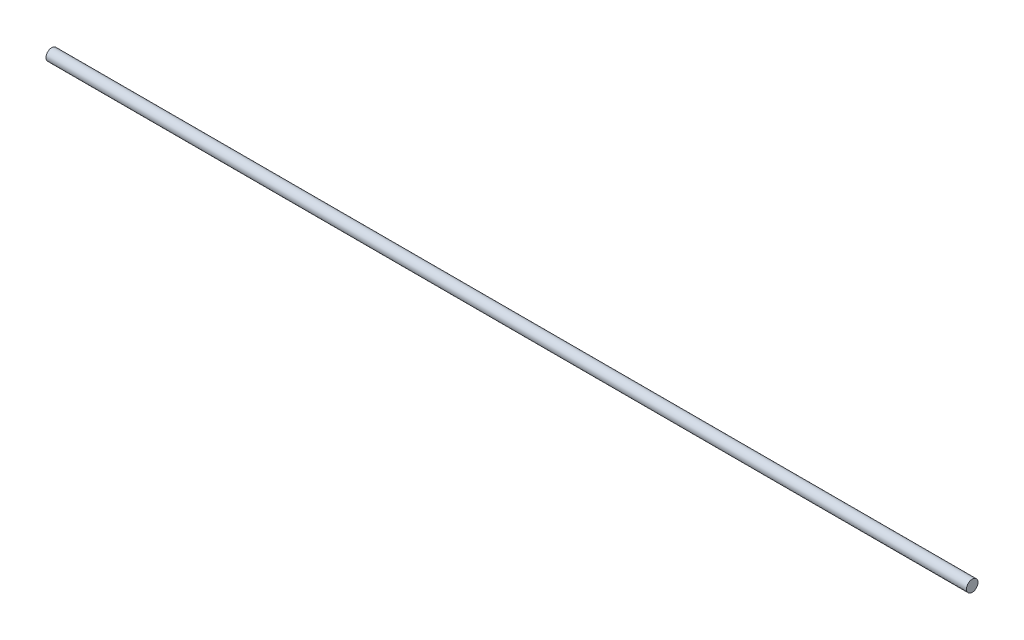
ISO-10303-21;
HEADER;
FILE_DESCRIPTION(('STEP AP214'),'2;1');
FILE_NAME('part.step','',(''),(''),'','','');
FILE_SCHEMA(('AUTOMOTIVE_DESIGN { 1 0 10303 214 1 1 1 1 }'));
ENDSEC;
DATA;
#1=APPLICATION_CONTEXT('core data for automotive mechanical design processes');
#2=APPLICATION_PROTOCOL_DEFINITION('international standard','automotive_design',2000,#1);
#3=PRODUCT_CONTEXT('',#1,'mechanical');
#4=PRODUCT('Part','Part','',(#3));
#5=PRODUCT_RELATED_PRODUCT_CATEGORY('part','',(#4));
#6=PRODUCT_DEFINITION_FORMATION('','',#4);
#7=PRODUCT_DEFINITION_CONTEXT('part definition',#1,'design');
#8=PRODUCT_DEFINITION('design','',#6,#7);
#9=PRODUCT_DEFINITION_SHAPE('','',#8);
#10=(LENGTH_UNIT() NAMED_UNIT(*) SI_UNIT(.MILLI.,.METRE.));
#11=(NAMED_UNIT(*) PLANE_ANGLE_UNIT() SI_UNIT($,.RADIAN.));
#12=(NAMED_UNIT(*) SI_UNIT($,.STERADIAN.) SOLID_ANGLE_UNIT());
#13=UNCERTAINTY_MEASURE_WITH_UNIT(LENGTH_MEASURE(1.E-05),#10,'distance_accuracy_value','');
#14=(GEOMETRIC_REPRESENTATION_CONTEXT(3) GLOBAL_UNCERTAINTY_ASSIGNED_CONTEXT((#13)) GLOBAL_UNIT_ASSIGNED_CONTEXT((#10,
#11,#12)) REPRESENTATION_CONTEXT('',''));
#15=CARTESIAN_POINT('',(0.,0.,0.));
#16=DIRECTION('',(0.,0.,1.));
#17=DIRECTION('',(1.,0.,0.));
#18=AXIS2_PLACEMENT_3D('',#15,#16,#17);
#19=CARTESIAN_POINT('',(400.,0.,0.));
#20=DIRECTION('',(-1.,0.,0.));
#21=DIRECTION('',(0.,0.,1.));
#22=AXIS2_PLACEMENT_3D('',#19,#20,#21);
#23=CYLINDRICAL_SURFACE('',#22,5.);
#24=CARTESIAN_POINT('',(400.,0.,0.));
#25=DIRECTION('',(1.,0.,0.));
#26=DIRECTION('',(0.,0.,-1.));
#27=AXIS2_PLACEMENT_3D('',#24,#25,#26);
#28=CIRCLE('',#27,5.);
#29=CARTESIAN_POINT('',(400.,0.,-5.));
#30=VERTEX_POINT('',#29);
#31=EDGE_CURVE('E10',#30,#30,#28,.T.);
#32=ORIENTED_EDGE('',*,*,#31,.F.);
#33=EDGE_LOOP('',(#32));
#34=FACE_BOUND('',#33,.T.);
#35=CARTESIAN_POINT('',(-400.,0.,0.));
#36=DIRECTION('',(1.,0.,0.));
#37=DIRECTION('',(0.,0.,-1.));
#38=AXIS2_PLACEMENT_3D('',#35,#36,#37);
#39=CIRCLE('',#38,5.);
#40=CARTESIAN_POINT('',(-400.,0.,-5.));
#41=VERTEX_POINT('',#40);
#42=EDGE_CURVE('E42',#41,#41,#39,.T.);
#43=ORIENTED_EDGE('',*,*,#42,.T.);
#44=EDGE_LOOP('',(#43));
#45=FACE_BOUND('',#44,.T.);
#46=ADVANCED_FACE('F39',(#34,#45),#23,.T.);
#47=CARTESIAN_POINT('',(400.,0.,0.));
#48=DIRECTION('',(1.,0.,0.));
#49=DIRECTION('',(0.,0.,-1.));
#50=AXIS2_PLACEMENT_3D('',#47,#48,#49);
#51=PLANE('',#50);
#52=ORIENTED_EDGE('',*,*,#31,.T.);
#53=EDGE_LOOP('',(#52));
#54=FACE_BOUND('',#53,.T.);
#55=ADVANCED_FACE('F54',(#54),#51,.T.);
#56=CARTESIAN_POINT('',(-400.,0.,0.));
#57=DIRECTION('',(1.,0.,0.));
#58=DIRECTION('',(0.,0.,-1.));
#59=AXIS2_PLACEMENT_3D('',#56,#57,#58);
#60=PLANE('',#59);
#61=ORIENTED_EDGE('',*,*,#42,.F.);
#62=EDGE_LOOP('',(#61));
#63=FACE_BOUND('',#62,.T.);
#64=ADVANCED_FACE('F52',(#63),#60,.F.);
#65=CLOSED_SHELL('',(#46,#55,#64));
#66=MANIFOLD_SOLID_BREP('B2',#65);
#67=ADVANCED_BREP_SHAPE_REPRESENTATION('',(#18,#66),#14);
#68=SHAPE_DEFINITION_REPRESENTATION(#9,#67);
ENDSEC;
END-ISO-10303-21;
